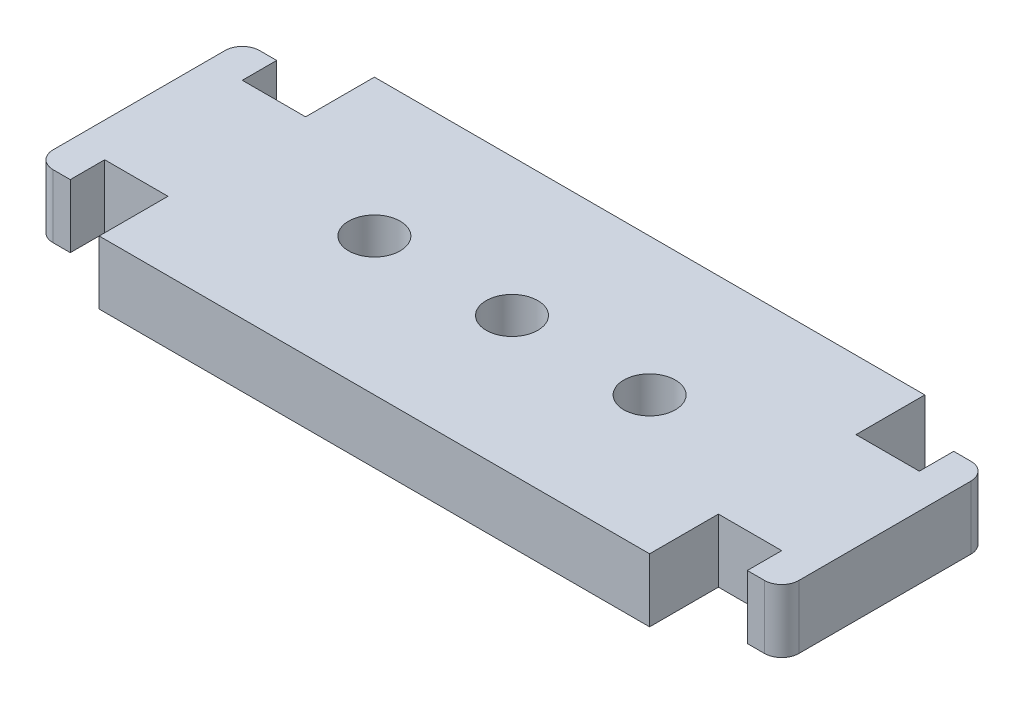
ISO-10303-21;
HEADER;
FILE_DESCRIPTION(('STEP AP214'),'2;1');
FILE_NAME('part.step','',(''),(''),'','','');
FILE_SCHEMA(('AUTOMOTIVE_DESIGN { 1 0 10303 214 1 1 1 1 }'));
ENDSEC;
DATA;
#1=APPLICATION_CONTEXT('core data for automotive mechanical design processes');
#2=APPLICATION_PROTOCOL_DEFINITION('international standard','automotive_design',2000,#1);
#3=PRODUCT_CONTEXT('',#1,'mechanical');
#4=PRODUCT('Part','Part','',(#3));
#5=PRODUCT_RELATED_PRODUCT_CATEGORY('part','',(#4));
#6=PRODUCT_DEFINITION_FORMATION('','',#4);
#7=PRODUCT_DEFINITION_CONTEXT('part definition',#1,'design');
#8=PRODUCT_DEFINITION('design','',#6,#7);
#9=PRODUCT_DEFINITION_SHAPE('','',#8);
#10=(LENGTH_UNIT() NAMED_UNIT(*) SI_UNIT(.MILLI.,.METRE.));
#11=(NAMED_UNIT(*) PLANE_ANGLE_UNIT() SI_UNIT($,.RADIAN.));
#12=(NAMED_UNIT(*) SI_UNIT($,.STERADIAN.) SOLID_ANGLE_UNIT());
#13=UNCERTAINTY_MEASURE_WITH_UNIT(LENGTH_MEASURE(1.E-05),#10,'distance_accuracy_value','');
#14=(GEOMETRIC_REPRESENTATION_CONTEXT(3) GLOBAL_UNCERTAINTY_ASSIGNED_CONTEXT((#13)) GLOBAL_UNIT_ASSIGNED_CONTEXT((#10,
#11,#12)) REPRESENTATION_CONTEXT('',''));
#15=CARTESIAN_POINT('',(0.,0.,0.));
#16=DIRECTION('',(0.,0.,1.));
#17=DIRECTION('',(1.,0.,0.));
#18=AXIS2_PLACEMENT_3D('',#15,#16,#17);
#19=CARTESIAN_POINT('',(25.4,5.842,-6.35));
#20=DIRECTION('',(-1.,0.,0.));
#21=DIRECTION('',(0.,0.,1.));
#22=AXIS2_PLACEMENT_3D('',#19,#20,#21);
#23=PLANE('',#22);
#24=DIRECTION('',(0.,0.,-1.));
#25=VECTOR('',#24,1.);
#26=CARTESIAN_POINT('',(25.4,0.,-6.35));
#27=LINE('',#26,#25);
#28=CARTESIAN_POINT('',(25.4,0.,-6.35));
#29=VERTEX_POINT('',#28);
#30=CARTESIAN_POINT('',(25.4,0.,-12.7));
#31=VERTEX_POINT('',#30);
#32=EDGE_CURVE('E219',#29,#31,#27,.T.);
#33=ORIENTED_EDGE('',*,*,#32,.T.);
#34=DIRECTION('',(0.,-1.,0.));
#35=VECTOR('',#34,1.);
#36=CARTESIAN_POINT('',(25.4,5.842,-12.7));
#37=LINE('',#36,#35);
#38=CARTESIAN_POINT('',(25.4,5.842,-12.7));
#39=VERTEX_POINT('',#38);
#40=EDGE_CURVE('E200',#39,#31,#37,.T.);
#41=ORIENTED_EDGE('',*,*,#40,.F.);
#42=DIRECTION('',(0.,0.,-1.));
#43=VECTOR('',#42,1.);
#44=CARTESIAN_POINT('',(25.4,5.842,-6.35));
#45=LINE('',#44,#43);
#46=CARTESIAN_POINT('',(25.4,5.842,-6.35));
#47=VERTEX_POINT('',#46);
#48=EDGE_CURVE('E206',#47,#39,#45,.T.);
#49=ORIENTED_EDGE('',*,*,#48,.F.);
#50=DIRECTION('',(0.,-1.,0.));
#51=VECTOR('',#50,1.);
#52=CARTESIAN_POINT('',(25.4,5.842,-6.35));
#53=LINE('',#52,#51);
#54=EDGE_CURVE('E312',#47,#29,#53,.T.);
#55=ORIENTED_EDGE('',*,*,#54,.T.);
#56=EDGE_LOOP('',(#33,#41,#49,#55));
#57=FACE_BOUND('',#56,.T.);
#58=ADVANCED_FACE('F35',(#57),#23,.F.);
#59=CARTESIAN_POINT('',(-25.4,5.842,-12.7));
#60=DIRECTION('',(0.,0.,1.));
#61=DIRECTION('',(1.,0.,0.));
#62=AXIS2_PLACEMENT_3D('',#59,#60,#61);
#63=PLANE('',#62);
#64=DIRECTION('',(-1.,0.,0.));
#65=VECTOR('',#64,1.);
#66=CARTESIAN_POINT('',(-25.4,0.,-12.7));
#67=LINE('',#66,#65);
#68=CARTESIAN_POINT('',(-25.4,0.,-12.7));
#69=VERTEX_POINT('',#68);
#70=EDGE_CURVE('E365',#31,#69,#67,.T.);
#71=ORIENTED_EDGE('',*,*,#70,.T.);
#72=DIRECTION('',(0.,-1.,0.));
#73=VECTOR('',#72,1.);
#74=CARTESIAN_POINT('',(-25.4,5.842,-12.7));
#75=LINE('',#74,#73);
#76=CARTESIAN_POINT('',(-25.4,5.842,-12.7));
#77=VERTEX_POINT('',#76);
#78=EDGE_CURVE('E203',#77,#69,#75,.T.);
#79=ORIENTED_EDGE('',*,*,#78,.F.);
#80=DIRECTION('',(-1.,0.,0.));
#81=VECTOR('',#80,1.);
#82=CARTESIAN_POINT('',(-25.4,5.842,-12.7));
#83=LINE('',#82,#81);
#84=EDGE_CURVE('E196',#39,#77,#83,.T.);
#85=ORIENTED_EDGE('',*,*,#84,.F.);
#86=ORIENTED_EDGE('',*,*,#40,.T.);
#87=EDGE_LOOP('',(#71,#79,#85,#86));
#88=FACE_BOUND('',#87,.T.);
#89=ADVANCED_FACE('F198',(#88),#63,.F.);
#90=CARTESIAN_POINT('',(-25.4,5.842,-6.35));
#91=DIRECTION('',(1.,0.,0.));
#92=DIRECTION('',(0.,0.,-1.));
#93=AXIS2_PLACEMENT_3D('',#90,#91,#92);
#94=PLANE('',#93);
#95=DIRECTION('',(0.,0.,1.));
#96=VECTOR('',#95,1.);
#97=CARTESIAN_POINT('',(-25.4,0.,-6.35));
#98=LINE('',#97,#96);
#99=CARTESIAN_POINT('',(-25.4,0.,-6.35));
#100=VERTEX_POINT('',#99);
#101=EDGE_CURVE('E360',#69,#100,#98,.T.);
#102=ORIENTED_EDGE('',*,*,#101,.T.);
#103=DIRECTION('',(0.,-1.,0.));
#104=VECTOR('',#103,1.);
#105=CARTESIAN_POINT('',(-25.4,5.842,-6.35));
#106=LINE('',#105,#104);
#107=CARTESIAN_POINT('',(-25.4,5.842,-6.35));
#108=VERTEX_POINT('',#107);
#109=EDGE_CURVE('E224',#108,#100,#106,.T.);
#110=ORIENTED_EDGE('',*,*,#109,.F.);
#111=DIRECTION('',(0.,0.,1.));
#112=VECTOR('',#111,1.);
#113=CARTESIAN_POINT('',(-25.4,5.842,-6.35));
#114=LINE('',#113,#112);
#115=EDGE_CURVE('E205',#77,#108,#114,.T.);
#116=ORIENTED_EDGE('',*,*,#115,.F.);
#117=ORIENTED_EDGE('',*,*,#78,.T.);
#118=EDGE_LOOP('',(#102,#110,#116,#117));
#119=FACE_BOUND('',#118,.T.);
#120=ADVANCED_FACE('F390',(#119),#94,.F.);
#121=CARTESIAN_POINT('',(-31.242,5.842,-6.35));
#122=DIRECTION('',(0.,0.,1.));
#123=DIRECTION('',(1.,0.,0.));
#124=AXIS2_PLACEMENT_3D('',#121,#122,#123);
#125=PLANE('',#124);
#126=DIRECTION('',(-1.,0.,0.));
#127=VECTOR('',#126,1.);
#128=CARTESIAN_POINT('',(-31.242,0.,-6.35));
#129=LINE('',#128,#127);
#130=CARTESIAN_POINT('',(-31.242,0.,-6.35));
#131=VERTEX_POINT('',#130);
#132=EDGE_CURVE('E355',#100,#131,#129,.T.);
#133=ORIENTED_EDGE('',*,*,#132,.T.);
#134=DIRECTION('',(0.,-1.,0.));
#135=VECTOR('',#134,1.);
#136=CARTESIAN_POINT('',(-31.242,5.842,-6.35));
#137=LINE('',#136,#135);
#138=CARTESIAN_POINT('',(-31.242,5.842,-6.35));
#139=VERTEX_POINT('',#138);
#140=EDGE_CURVE('E346',#139,#131,#137,.T.);
#141=ORIENTED_EDGE('',*,*,#140,.F.);
#142=DIRECTION('',(-1.,0.,0.));
#143=VECTOR('',#142,1.);
#144=CARTESIAN_POINT('',(-31.242,5.842,-6.35));
#145=LINE('',#144,#143);
#146=EDGE_CURVE('E356',#108,#139,#145,.T.);
#147=ORIENTED_EDGE('',*,*,#146,.F.);
#148=ORIENTED_EDGE('',*,*,#109,.T.);
#149=EDGE_LOOP('',(#133,#141,#147,#148));
#150=FACE_BOUND('',#149,.T.);
#151=ADVANCED_FACE('F353',(#150),#125,.F.);
#152=CARTESIAN_POINT('',(-31.242,5.842,-6.35));
#153=DIRECTION('',(-1.,0.,0.));
#154=DIRECTION('',(0.,0.,1.));
#155=AXIS2_PLACEMENT_3D('',#152,#153,#154);
#156=PLANE('',#155);
#157=DIRECTION('',(0.,0.,-1.));
#158=VECTOR('',#157,1.);
#159=CARTESIAN_POINT('',(-31.242,0.,-6.35));
#160=LINE('',#159,#158);
#161=CARTESIAN_POINT('',(-31.242,0.,-9.525));
#162=VERTEX_POINT('',#161);
#163=EDGE_CURVE('E362',#131,#162,#160,.T.);
#164=ORIENTED_EDGE('',*,*,#163,.T.);
#165=DIRECTION('',(0.,-1.,0.));
#166=VECTOR('',#165,1.);
#167=CARTESIAN_POINT('',(-31.242,5.842,-9.525));
#168=LINE('',#167,#166);
#169=CARTESIAN_POINT('',(-31.242,5.842,-9.525));
#170=VERTEX_POINT('',#169);
#171=EDGE_CURVE('E343',#170,#162,#168,.T.);
#172=ORIENTED_EDGE('',*,*,#171,.F.);
#173=DIRECTION('',(0.,0.,-1.));
#174=VECTOR('',#173,1.);
#175=CARTESIAN_POINT('',(-31.242,5.842,-6.35));
#176=LINE('',#175,#174);
#177=EDGE_CURVE('E424',#139,#170,#176,.T.);
#178=ORIENTED_EDGE('',*,*,#177,.F.);
#179=ORIENTED_EDGE('',*,*,#140,.T.);
#180=EDGE_LOOP('',(#164,#172,#178,#179));
#181=FACE_BOUND('',#180,.T.);
#182=ADVANCED_FACE('F504',(#181),#156,.F.);
#183=CARTESIAN_POINT('',(-34.417,5.842,-9.525));
#184=DIRECTION('',(0.,0.,1.));
#185=DIRECTION('',(1.,0.,0.));
#186=AXIS2_PLACEMENT_3D('',#183,#184,#185);
#187=PLANE('',#186);
#188=DIRECTION('',(-1.,0.,0.));
#189=VECTOR('',#188,1.);
#190=CARTESIAN_POINT('',(-34.417,0.,-9.525));
#191=LINE('',#190,#189);
#192=CARTESIAN_POINT('',(-32.8295,0.,-9.525));
#193=VERTEX_POINT('',#192);
#194=EDGE_CURVE('E286',#162,#193,#191,.T.);
#195=ORIENTED_EDGE('',*,*,#194,.T.);
#196=DIRECTION('',(0.,-1.,0.));
#197=VECTOR('',#196,1.);
#198=CARTESIAN_POINT('',(-32.8295,5.842,-9.525));
#199=LINE('',#198,#197);
#200=CARTESIAN_POINT('',(-32.8295,5.842,-9.525));
#201=VERTEX_POINT('',#200);
#202=EDGE_CURVE('E11',#193,#201,#199,.F.);
#203=ORIENTED_EDGE('',*,*,#202,.T.);
#204=DIRECTION('',(-1.,0.,0.));
#205=VECTOR('',#204,1.);
#206=CARTESIAN_POINT('',(-34.417,5.842,-9.525));
#207=LINE('',#206,#205);
#208=EDGE_CURVE('E267',#170,#201,#207,.T.);
#209=ORIENTED_EDGE('',*,*,#208,.F.);
#210=ORIENTED_EDGE('',*,*,#171,.T.);
#211=EDGE_LOOP('',(#195,#203,#209,#210));
#212=FACE_BOUND('',#211,.T.);
#213=ADVANCED_FACE('F371',(#212),#187,.F.);
#214=CARTESIAN_POINT('',(-34.417,5.842,9.525));
#215=DIRECTION('',(1.,0.,0.));
#216=DIRECTION('',(0.,0.,-1.));
#217=AXIS2_PLACEMENT_3D('',#214,#215,#216);
#218=PLANE('',#217);
#219=DIRECTION('',(0.,0.,1.));
#220=VECTOR('',#219,1.);
#221=CARTESIAN_POINT('',(-34.417,0.,9.525));
#222=LINE('',#221,#220);
#223=CARTESIAN_POINT('',(-34.417,0.,-7.93749999999999));
#224=VERTEX_POINT('',#223);
#225=CARTESIAN_POINT('',(-34.417,0.,7.9375));
#226=VERTEX_POINT('',#225);
#227=EDGE_CURVE('E262',#224,#226,#222,.T.);
#228=ORIENTED_EDGE('',*,*,#227,.T.);
#229=DIRECTION('',(0.,-1.,0.));
#230=VECTOR('',#229,1.);
#231=CARTESIAN_POINT('',(-34.417,5.842,7.9375));
#232=LINE('',#231,#230);
#233=CARTESIAN_POINT('',(-34.417,5.842,7.9375));
#234=VERTEX_POINT('',#233);
#235=EDGE_CURVE('E43',#226,#234,#232,.F.);
#236=ORIENTED_EDGE('',*,*,#235,.T.);
#237=DIRECTION('',(0.,0.,1.));
#238=VECTOR('',#237,1.);
#239=CARTESIAN_POINT('',(-34.417,5.842,9.525));
#240=LINE('',#239,#238);
#241=CARTESIAN_POINT('',(-34.417,5.842,-7.93749999999999));
#242=VERTEX_POINT('',#241);
#243=EDGE_CURVE('E259',#242,#234,#240,.T.);
#244=ORIENTED_EDGE('',*,*,#243,.F.);
#245=DIRECTION('',(0.,-1.,0.));
#246=VECTOR('',#245,1.);
#247=CARTESIAN_POINT('',(-34.417,5.842,-7.9375));
#248=LINE('',#247,#246);
#249=EDGE_CURVE('E252',#242,#224,#248,.T.);
#250=ORIENTED_EDGE('',*,*,#249,.T.);
#251=EDGE_LOOP('',(#228,#236,#244,#250));
#252=FACE_BOUND('',#251,.T.);
#253=ADVANCED_FACE('F258',(#252),#218,.F.);
#254=CARTESIAN_POINT('',(-34.417,5.842,9.525));
#255=DIRECTION('',(0.,0.,-1.));
#256=DIRECTION('',(-1.,0.,0.));
#257=AXIS2_PLACEMENT_3D('',#254,#255,#256);
#258=PLANE('',#257);
#259=DIRECTION('',(1.,0.,0.));
#260=VECTOR('',#259,1.);
#261=CARTESIAN_POINT('',(-34.417,5.842,9.525));
#262=LINE('',#261,#260);
#263=CARTESIAN_POINT('',(-32.8295,5.842,9.525));
#264=VERTEX_POINT('',#263);
#265=CARTESIAN_POINT('',(-31.242,5.842,9.525));
#266=VERTEX_POINT('',#265);
#267=EDGE_CURVE('E266',#264,#266,#262,.T.);
#268=ORIENTED_EDGE('',*,*,#267,.F.);
#269=DIRECTION('',(0.,-1.,0.));
#270=VECTOR('',#269,1.);
#271=CARTESIAN_POINT('',(-32.8295,5.842,9.525));
#272=LINE('',#271,#270);
#273=CARTESIAN_POINT('',(-32.8295,0.,9.525));
#274=VERTEX_POINT('',#273);
#275=EDGE_CURVE('E249',#264,#274,#272,.T.);
#276=ORIENTED_EDGE('',*,*,#275,.T.);
#277=DIRECTION('',(1.,0.,0.));
#278=VECTOR('',#277,1.);
#279=CARTESIAN_POINT('',(-34.417,0.,9.525));
#280=LINE('',#279,#278);
#281=CARTESIAN_POINT('',(-31.242,0.,9.525));
#282=VERTEX_POINT('',#281);
#283=EDGE_CURVE('E275',#274,#282,#280,.T.);
#284=ORIENTED_EDGE('',*,*,#283,.T.);
#285=DIRECTION('',(0.,-1.,0.));
#286=VECTOR('',#285,1.);
#287=CARTESIAN_POINT('',(-31.242,5.842,9.525));
#288=LINE('',#287,#286);
#289=EDGE_CURVE('E341',#266,#282,#288,.T.);
#290=ORIENTED_EDGE('',*,*,#289,.F.);
#291=EDGE_LOOP('',(#268,#276,#284,#290));
#292=FACE_BOUND('',#291,.T.);
#293=ADVANCED_FACE('F273',(#292),#258,.F.);
#294=CARTESIAN_POINT('',(-31.242,5.842,9.525));
#295=DIRECTION('',(-1.,0.,0.));
#296=DIRECTION('',(0.,0.,1.));
#297=AXIS2_PLACEMENT_3D('',#294,#295,#296);
#298=PLANE('',#297);
#299=DIRECTION('',(0.,0.,-1.));
#300=VECTOR('',#299,1.);
#301=CARTESIAN_POINT('',(-31.242,0.,9.525));
#302=LINE('',#301,#300);
#303=CARTESIAN_POINT('',(-31.242,0.,6.35));
#304=VERTEX_POINT('',#303);
#305=EDGE_CURVE('E282',#282,#304,#302,.T.);
#306=ORIENTED_EDGE('',*,*,#305,.T.);
#307=DIRECTION('',(0.,-1.,0.));
#308=VECTOR('',#307,1.);
#309=CARTESIAN_POINT('',(-31.242,5.842,6.35));
#310=LINE('',#309,#308);
#311=CARTESIAN_POINT('',(-31.242,5.842,6.35));
#312=VERTEX_POINT('',#311);
#313=EDGE_CURVE('E338',#312,#304,#310,.T.);
#314=ORIENTED_EDGE('',*,*,#313,.F.);
#315=DIRECTION('',(0.,0.,-1.));
#316=VECTOR('',#315,1.);
#317=CARTESIAN_POINT('',(-31.242,5.842,9.525));
#318=LINE('',#317,#316);
#319=EDGE_CURVE('E430',#266,#312,#318,.T.);
#320=ORIENTED_EDGE('',*,*,#319,.F.);
#321=ORIENTED_EDGE('',*,*,#289,.T.);
#322=EDGE_LOOP('',(#306,#314,#320,#321));
#323=FACE_BOUND('',#322,.T.);
#324=ADVANCED_FACE('F489',(#323),#298,.F.);
#325=CARTESIAN_POINT('',(-31.242,5.842,6.35));
#326=DIRECTION('',(0.,0.,-1.));
#327=DIRECTION('',(-1.,0.,0.));
#328=AXIS2_PLACEMENT_3D('',#325,#326,#327);
#329=PLANE('',#328);
#330=DIRECTION('',(1.,0.,0.));
#331=VECTOR('',#330,1.);
#332=CARTESIAN_POINT('',(-31.242,0.,6.35));
#333=LINE('',#332,#331);
#334=CARTESIAN_POINT('',(-25.4,0.,6.35));
#335=VERTEX_POINT('',#334);
#336=EDGE_CURVE('E284',#304,#335,#333,.T.);
#337=ORIENTED_EDGE('',*,*,#336,.T.);
#338=DIRECTION('',(0.,-1.,0.));
#339=VECTOR('',#338,1.);
#340=CARTESIAN_POINT('',(-25.4,5.842,6.35));
#341=LINE('',#340,#339);
#342=CARTESIAN_POINT('',(-25.4,5.842,6.35));
#343=VERTEX_POINT('',#342);
#344=EDGE_CURVE('E335',#343,#335,#341,.T.);
#345=ORIENTED_EDGE('',*,*,#344,.F.);
#346=DIRECTION('',(1.,0.,0.));
#347=VECTOR('',#346,1.);
#348=CARTESIAN_POINT('',(-31.242,5.842,6.35));
#349=LINE('',#348,#347);
#350=EDGE_CURVE('E432',#312,#343,#349,.T.);
#351=ORIENTED_EDGE('',*,*,#350,.F.);
#352=ORIENTED_EDGE('',*,*,#313,.T.);
#353=EDGE_LOOP('',(#337,#345,#351,#352));
#354=FACE_BOUND('',#353,.T.);
#355=ADVANCED_FACE('F485',(#354),#329,.F.);
#356=CARTESIAN_POINT('',(-25.4,5.842,12.7));
#357=DIRECTION('',(1.,0.,0.));
#358=DIRECTION('',(0.,0.,-1.));
#359=AXIS2_PLACEMENT_3D('',#356,#357,#358);
#360=PLANE('',#359);
#361=DIRECTION('',(0.,0.,1.));
#362=VECTOR('',#361,1.);
#363=CARTESIAN_POINT('',(-25.4,0.,12.7));
#364=LINE('',#363,#362);
#365=CARTESIAN_POINT('',(-25.4,0.,12.7));
#366=VERTEX_POINT('',#365);
#367=EDGE_CURVE('E291',#335,#366,#364,.T.);
#368=ORIENTED_EDGE('',*,*,#367,.T.);
#369=DIRECTION('',(0.,-1.,0.));
#370=VECTOR('',#369,1.);
#371=CARTESIAN_POINT('',(-25.4,5.842,12.7));
#372=LINE('',#371,#370);
#373=CARTESIAN_POINT('',(-25.4,5.842,12.7));
#374=VERTEX_POINT('',#373);
#375=EDGE_CURVE('E332',#374,#366,#372,.T.);
#376=ORIENTED_EDGE('',*,*,#375,.F.);
#377=DIRECTION('',(0.,0.,1.));
#378=VECTOR('',#377,1.);
#379=CARTESIAN_POINT('',(-25.4,5.842,12.7));
#380=LINE('',#379,#378);
#381=EDGE_CURVE('E434',#343,#374,#380,.T.);
#382=ORIENTED_EDGE('',*,*,#381,.F.);
#383=ORIENTED_EDGE('',*,*,#344,.T.);
#384=EDGE_LOOP('',(#368,#376,#382,#383));
#385=FACE_BOUND('',#384,.T.);
#386=ADVANCED_FACE('F480',(#385),#360,.F.);
#387=CARTESIAN_POINT('',(-25.4,5.842,12.7));
#388=DIRECTION('',(0.,0.,-1.));
#389=DIRECTION('',(-1.,0.,0.));
#390=AXIS2_PLACEMENT_3D('',#387,#388,#389);
#391=PLANE('',#390);
#392=DIRECTION('',(1.,0.,0.));
#393=VECTOR('',#392,1.);
#394=CARTESIAN_POINT('',(-25.4,0.,12.7));
#395=LINE('',#394,#393);
#396=CARTESIAN_POINT('',(25.4,0.,12.7));
#397=VERTEX_POINT('',#396);
#398=EDGE_CURVE('E293',#366,#397,#395,.T.);
#399=ORIENTED_EDGE('',*,*,#398,.T.);
#400=DIRECTION('',(0.,-1.,0.));
#401=VECTOR('',#400,1.);
#402=CARTESIAN_POINT('',(25.4,5.842,12.7));
#403=LINE('',#402,#401);
#404=CARTESIAN_POINT('',(25.4,5.842,12.7));
#405=VERTEX_POINT('',#404);
#406=EDGE_CURVE('E329',#405,#397,#403,.T.);
#407=ORIENTED_EDGE('',*,*,#406,.F.);
#408=DIRECTION('',(1.,0.,0.));
#409=VECTOR('',#408,1.);
#410=CARTESIAN_POINT('',(-25.4,5.842,12.7));
#411=LINE('',#410,#409);
#412=EDGE_CURVE('E436',#374,#405,#411,.T.);
#413=ORIENTED_EDGE('',*,*,#412,.F.);
#414=ORIENTED_EDGE('',*,*,#375,.T.);
#415=EDGE_LOOP('',(#399,#407,#413,#414));
#416=FACE_BOUND('',#415,.T.);
#417=ADVANCED_FACE('F476',(#416),#391,.F.);
#418=CARTESIAN_POINT('',(25.4,5.842,12.7));
#419=DIRECTION('',(-1.,0.,0.));
#420=DIRECTION('',(0.,0.,1.));
#421=AXIS2_PLACEMENT_3D('',#418,#419,#420);
#422=PLANE('',#421);
#423=DIRECTION('',(0.,0.,-1.));
#424=VECTOR('',#423,1.);
#425=CARTESIAN_POINT('',(25.4,0.,12.7));
#426=LINE('',#425,#424);
#427=CARTESIAN_POINT('',(25.4,0.,6.35));
#428=VERTEX_POINT('',#427);
#429=EDGE_CURVE('E295',#397,#428,#426,.T.);
#430=ORIENTED_EDGE('',*,*,#429,.T.);
#431=DIRECTION('',(0.,-1.,0.));
#432=VECTOR('',#431,1.);
#433=CARTESIAN_POINT('',(25.4,5.842,6.35));
#434=LINE('',#433,#432);
#435=CARTESIAN_POINT('',(25.4,5.842,6.35));
#436=VERTEX_POINT('',#435);
#437=EDGE_CURVE('E326',#436,#428,#434,.T.);
#438=ORIENTED_EDGE('',*,*,#437,.F.);
#439=DIRECTION('',(0.,0.,-1.));
#440=VECTOR('',#439,1.);
#441=CARTESIAN_POINT('',(25.4,5.842,12.7));
#442=LINE('',#441,#440);
#443=EDGE_CURVE('E438',#405,#436,#442,.T.);
#444=ORIENTED_EDGE('',*,*,#443,.F.);
#445=ORIENTED_EDGE('',*,*,#406,.T.);
#446=EDGE_LOOP('',(#430,#438,#444,#445));
#447=FACE_BOUND('',#446,.T.);
#448=ADVANCED_FACE('F472',(#447),#422,.F.);
#449=CARTESIAN_POINT('',(31.242,5.842,6.35));
#450=DIRECTION('',(0.,0.,-1.));
#451=DIRECTION('',(-1.,0.,0.));
#452=AXIS2_PLACEMENT_3D('',#449,#450,#451);
#453=PLANE('',#452);
#454=DIRECTION('',(1.,0.,0.));
#455=VECTOR('',#454,1.);
#456=CARTESIAN_POINT('',(31.242,0.,6.35));
#457=LINE('',#456,#455);
#458=CARTESIAN_POINT('',(31.242,0.,6.35));
#459=VERTEX_POINT('',#458);
#460=EDGE_CURVE('E297',#428,#459,#457,.T.);
#461=ORIENTED_EDGE('',*,*,#460,.T.);
#462=DIRECTION('',(0.,-1.,0.));
#463=VECTOR('',#462,1.);
#464=CARTESIAN_POINT('',(31.242,5.842,6.35));
#465=LINE('',#464,#463);
#466=CARTESIAN_POINT('',(31.242,5.842,6.35));
#467=VERTEX_POINT('',#466);
#468=EDGE_CURVE('E323',#467,#459,#465,.T.);
#469=ORIENTED_EDGE('',*,*,#468,.F.);
#470=DIRECTION('',(1.,0.,0.));
#471=VECTOR('',#470,1.);
#472=CARTESIAN_POINT('',(31.242,5.842,6.35));
#473=LINE('',#472,#471);
#474=EDGE_CURVE('E440',#436,#467,#473,.T.);
#475=ORIENTED_EDGE('',*,*,#474,.F.);
#476=ORIENTED_EDGE('',*,*,#437,.T.);
#477=EDGE_LOOP('',(#461,#469,#475,#476));
#478=FACE_BOUND('',#477,.T.);
#479=ADVANCED_FACE('F467',(#478),#453,.F.);
#480=CARTESIAN_POINT('',(31.242,5.842,9.525));
#481=DIRECTION('',(1.,0.,0.));
#482=DIRECTION('',(0.,0.,-1.));
#483=AXIS2_PLACEMENT_3D('',#480,#481,#482);
#484=PLANE('',#483);
#485=DIRECTION('',(0.,0.,1.));
#486=VECTOR('',#485,1.);
#487=CARTESIAN_POINT('',(31.242,0.,9.525));
#488=LINE('',#487,#486);
#489=CARTESIAN_POINT('',(31.242,0.,9.525));
#490=VERTEX_POINT('',#489);
#491=EDGE_CURVE('E299',#459,#490,#488,.T.);
#492=ORIENTED_EDGE('',*,*,#491,.T.);
#493=DIRECTION('',(0.,-1.,0.));
#494=VECTOR('',#493,1.);
#495=CARTESIAN_POINT('',(31.242,5.842,9.525));
#496=LINE('',#495,#494);
#497=CARTESIAN_POINT('',(31.242,5.842,9.525));
#498=VERTEX_POINT('',#497);
#499=EDGE_CURVE('E320',#498,#490,#496,.T.);
#500=ORIENTED_EDGE('',*,*,#499,.F.);
#501=DIRECTION('',(0.,0.,1.));
#502=VECTOR('',#501,1.);
#503=CARTESIAN_POINT('',(31.242,5.842,9.525));
#504=LINE('',#503,#502);
#505=EDGE_CURVE('E442',#467,#498,#504,.T.);
#506=ORIENTED_EDGE('',*,*,#505,.F.);
#507=ORIENTED_EDGE('',*,*,#468,.T.);
#508=EDGE_LOOP('',(#492,#500,#506,#507));
#509=FACE_BOUND('',#508,.T.);
#510=ADVANCED_FACE('F461',(#509),#484,.F.);
#511=CARTESIAN_POINT('',(34.417,5.842,9.525));
#512=DIRECTION('',(0.,0.,-1.));
#513=DIRECTION('',(-1.,0.,0.));
#514=AXIS2_PLACEMENT_3D('',#511,#512,#513);
#515=PLANE('',#514);
#516=DIRECTION('',(1.,0.,0.));
#517=VECTOR('',#516,1.);
#518=CARTESIAN_POINT('',(34.417,0.,9.525));
#519=LINE('',#518,#517);
#520=CARTESIAN_POINT('',(32.8295,0.,9.525));
#521=VERTEX_POINT('',#520);
#522=EDGE_CURVE('E301',#490,#521,#519,.T.);
#523=ORIENTED_EDGE('',*,*,#522,.T.);
#524=DIRECTION('',(0.,-1.,0.));
#525=VECTOR('',#524,1.);
#526=CARTESIAN_POINT('',(32.8295,5.842,9.525));
#527=LINE('',#526,#525);
#528=CARTESIAN_POINT('',(32.8295,5.842,9.525));
#529=VERTEX_POINT('',#528);
#530=EDGE_CURVE('E238',#521,#529,#527,.F.);
#531=ORIENTED_EDGE('',*,*,#530,.T.);
#532=DIRECTION('',(1.,0.,0.));
#533=VECTOR('',#532,1.);
#534=CARTESIAN_POINT('',(34.417,5.842,9.525));
#535=LINE('',#534,#533);
#536=EDGE_CURVE('E444',#498,#529,#535,.T.);
#537=ORIENTED_EDGE('',*,*,#536,.F.);
#538=ORIENTED_EDGE('',*,*,#499,.T.);
#539=EDGE_LOOP('',(#523,#531,#537,#538));
#540=FACE_BOUND('',#539,.T.);
#541=ADVANCED_FACE('F456',(#540),#515,.F.);
#542=CARTESIAN_POINT('',(34.417,5.842,9.525));
#543=DIRECTION('',(-1.,0.,0.));
#544=DIRECTION('',(0.,0.,1.));
#545=AXIS2_PLACEMENT_3D('',#542,#543,#544);
#546=PLANE('',#545);
#547=DIRECTION('',(0.,0.,-1.));
#548=VECTOR('',#547,1.);
#549=CARTESIAN_POINT('',(34.417,5.842,9.525));
#550=LINE('',#549,#548);
#551=CARTESIAN_POINT('',(34.417,5.842,7.9375));
#552=VERTEX_POINT('',#551);
#553=CARTESIAN_POINT('',(34.417,5.842,-7.93749999999999));
#554=VERTEX_POINT('',#553);
#555=EDGE_CURVE('E446',#552,#554,#550,.T.);
#556=ORIENTED_EDGE('',*,*,#555,.F.);
#557=DIRECTION('',(0.,-1.,0.));
#558=VECTOR('',#557,1.);
#559=CARTESIAN_POINT('',(34.417,5.842,7.9375));
#560=LINE('',#559,#558);
#561=CARTESIAN_POINT('',(34.417,0.,7.9375));
#562=VERTEX_POINT('',#561);
#563=EDGE_CURVE('E222',#552,#562,#560,.T.);
#564=ORIENTED_EDGE('',*,*,#563,.T.);
#565=DIRECTION('',(0.,0.,-1.));
#566=VECTOR('',#565,1.);
#567=CARTESIAN_POINT('',(34.417,0.,9.525));
#568=LINE('',#567,#566);
#569=CARTESIAN_POINT('',(34.417,0.,-7.93749999999999));
#570=VERTEX_POINT('',#569);
#571=EDGE_CURVE('E304',#562,#570,#568,.T.);
#572=ORIENTED_EDGE('',*,*,#571,.T.);
#573=DIRECTION('',(0.,-1.,0.));
#574=VECTOR('',#573,1.);
#575=CARTESIAN_POINT('',(34.417,5.842,-7.9375));
#576=LINE('',#575,#574);
#577=EDGE_CURVE('E220',#570,#554,#576,.F.);
#578=ORIENTED_EDGE('',*,*,#577,.T.);
#579=EDGE_LOOP('',(#556,#564,#572,#578));
#580=FACE_BOUND('',#579,.T.);
#581=ADVANCED_FACE('F451',(#580),#546,.F.);
#582=CARTESIAN_POINT('',(34.417,5.842,-9.525));
#583=DIRECTION('',(0.,0.,1.));
#584=DIRECTION('',(1.,0.,0.));
#585=AXIS2_PLACEMENT_3D('',#582,#583,#584);
#586=PLANE('',#585);
#587=DIRECTION('',(-1.,0.,0.));
#588=VECTOR('',#587,1.);
#589=CARTESIAN_POINT('',(34.417,5.842,-9.525));
#590=LINE('',#589,#588);
#591=CARTESIAN_POINT('',(32.8295,5.842,-9.525));
#592=VERTEX_POINT('',#591);
#593=CARTESIAN_POINT('',(31.242,5.842,-9.525));
#594=VERTEX_POINT('',#593);
#595=EDGE_CURVE('E408',#592,#594,#590,.T.);
#596=ORIENTED_EDGE('',*,*,#595,.F.);
#597=DIRECTION('',(0.,-1.,0.));
#598=VECTOR('',#597,1.);
#599=CARTESIAN_POINT('',(32.8295,5.842,-9.525));
#600=LINE('',#599,#598);
#601=CARTESIAN_POINT('',(32.8295,0.,-9.525));
#602=VERTEX_POINT('',#601);
#603=EDGE_CURVE('E246',#592,#602,#600,.T.);
#604=ORIENTED_EDGE('',*,*,#603,.T.);
#605=DIRECTION('',(-1.,0.,0.));
#606=VECTOR('',#605,1.);
#607=CARTESIAN_POINT('',(34.417,0.,-9.525));
#608=LINE('',#607,#606);
#609=CARTESIAN_POINT('',(31.242,0.,-9.525));
#610=VERTEX_POINT('',#609);
#611=EDGE_CURVE('E307',#602,#610,#608,.T.);
#612=ORIENTED_EDGE('',*,*,#611,.T.);
#613=DIRECTION('',(0.,-1.,0.));
#614=VECTOR('',#613,1.);
#615=CARTESIAN_POINT('',(31.242,5.842,-9.525));
#616=LINE('',#615,#614);
#617=EDGE_CURVE('E317',#594,#610,#616,.T.);
#618=ORIENTED_EDGE('',*,*,#617,.F.);
#619=EDGE_LOOP('',(#596,#604,#612,#618));
#620=FACE_BOUND('',#619,.T.);
#621=ADVANCED_FACE('F406',(#620),#586,.F.);
#622=CARTESIAN_POINT('',(31.242,5.842,-6.35));
#623=DIRECTION('',(1.,0.,0.));
#624=DIRECTION('',(0.,0.,-1.));
#625=AXIS2_PLACEMENT_3D('',#622,#623,#624);
#626=PLANE('',#625);
#627=DIRECTION('',(0.,0.,1.));
#628=VECTOR('',#627,1.);
#629=CARTESIAN_POINT('',(31.242,0.,-6.35));
#630=LINE('',#629,#628);
#631=CARTESIAN_POINT('',(31.242,0.,-6.35));
#632=VERTEX_POINT('',#631);
#633=EDGE_CURVE('E309',#610,#632,#630,.T.);
#634=ORIENTED_EDGE('',*,*,#633,.T.);
#635=DIRECTION('',(0.,-1.,0.));
#636=VECTOR('',#635,1.);
#637=CARTESIAN_POINT('',(31.242,5.842,-6.35));
#638=LINE('',#637,#636);
#639=CARTESIAN_POINT('',(31.242,5.842,-6.35));
#640=VERTEX_POINT('',#639);
#641=EDGE_CURVE('E314',#640,#632,#638,.T.);
#642=ORIENTED_EDGE('',*,*,#641,.F.);
#643=DIRECTION('',(0.,0.,1.));
#644=VECTOR('',#643,1.);
#645=CARTESIAN_POINT('',(31.242,5.842,-6.35));
#646=LINE('',#645,#644);
#647=EDGE_CURVE('E417',#594,#640,#646,.T.);
#648=ORIENTED_EDGE('',*,*,#647,.F.);
#649=ORIENTED_EDGE('',*,*,#617,.T.);
#650=EDGE_LOOP('',(#634,#642,#648,#649));
#651=FACE_BOUND('',#650,.T.);
#652=ADVANCED_FACE('F413',(#651),#626,.F.);
#653=CARTESIAN_POINT('',(31.242,5.842,-6.35));
#654=DIRECTION('',(0.,0.,1.));
#655=DIRECTION('',(1.,0.,0.));
#656=AXIS2_PLACEMENT_3D('',#653,#654,#655);
#657=PLANE('',#656);
#658=DIRECTION('',(-1.,0.,0.));
#659=VECTOR('',#658,1.);
#660=CARTESIAN_POINT('',(31.242,0.,-6.35));
#661=LINE('',#660,#659);
#662=EDGE_CURVE('E216',#632,#29,#661,.T.);
#663=ORIENTED_EDGE('',*,*,#662,.T.);
#664=ORIENTED_EDGE('',*,*,#54,.F.);
#665=DIRECTION('',(-1.,0.,0.));
#666=VECTOR('',#665,1.);
#667=CARTESIAN_POINT('',(31.242,5.842,-6.35));
#668=LINE('',#667,#666);
#669=EDGE_CURVE('E212',#640,#47,#668,.T.);
#670=ORIENTED_EDGE('',*,*,#669,.F.);
#671=ORIENTED_EDGE('',*,*,#641,.T.);
#672=EDGE_LOOP('',(#663,#664,#670,#671));
#673=FACE_BOUND('',#672,.T.);
#674=ADVANCED_FACE('F416',(#673),#657,.F.);
#675=CARTESIAN_POINT('',(0.,5.842,0.));
#676=DIRECTION('',(0.,-1.,0.));
#677=DIRECTION('',(0.,0.,-1.));
#678=AXIS2_PLACEMENT_3D('',#675,#676,#677);
#679=PLANE('',#678);
#680=CARTESIAN_POINT('',(-12.7,5.842,0.));
#681=DIRECTION('',(0.,1.,0.));
#682=DIRECTION('',(0.,0.,-1.));
#683=AXIS2_PLACEMENT_3D('',#680,#681,#682);
#684=CIRCLE('',#683,2.38125);
#685=CARTESIAN_POINT('',(-12.7,5.842,-2.38125));
#686=VERTEX_POINT('',#685);
#687=EDGE_CURVE('E700',#686,#686,#684,.T.);
#688=ORIENTED_EDGE('',*,*,#687,.F.);
#689=EDGE_LOOP('',(#688));
#690=FACE_BOUND('',#689,.T.);
#691=CARTESIAN_POINT('',(12.7,5.842,0.));
#692=DIRECTION('',(0.,1.,0.));
#693=DIRECTION('',(0.,0.,1.));
#694=AXIS2_PLACEMENT_3D('',#691,#692,#693);
#695=CIRCLE('',#694,2.38125);
#696=CARTESIAN_POINT('',(12.7,5.842,2.38125));
#697=VERTEX_POINT('',#696);
#698=EDGE_CURVE('E702',#697,#697,#695,.T.);
#699=ORIENTED_EDGE('',*,*,#698,.F.);
#700=EDGE_LOOP('',(#699));
#701=FACE_BOUND('',#700,.T.);
#702=CARTESIAN_POINT('',(0.,5.842,0.));
#703=DIRECTION('',(0.,1.,0.));
#704=DIRECTION('',(0.,0.,1.));
#705=AXIS2_PLACEMENT_3D('',#702,#703,#704);
#706=CIRCLE('',#705,2.38125);
#707=CARTESIAN_POINT('',(0.,5.842,2.38125));
#708=VERTEX_POINT('',#707);
#709=EDGE_CURVE('E708',#708,#708,#706,.T.);
#710=ORIENTED_EDGE('',*,*,#709,.F.);
#711=EDGE_LOOP('',(#710));
#712=FACE_BOUND('',#711,.T.);
#713=ORIENTED_EDGE('',*,*,#536,.T.);
#714=CARTESIAN_POINT('',(32.8295,5.842,7.9375));
#715=DIRECTION('',(0.,-1.,0.));
#716=DIRECTION('',(0.,0.,-1.));
#717=AXIS2_PLACEMENT_3D('',#714,#715,#716);
#718=CIRCLE('',#717,1.5875);
#719=EDGE_CURVE('E244',#529,#552,#718,.F.);
#720=ORIENTED_EDGE('',*,*,#719,.T.);
#721=ORIENTED_EDGE('',*,*,#555,.T.);
#722=CARTESIAN_POINT('',(32.8295,5.842,-7.9375));
#723=DIRECTION('',(0.,-1.,0.));
#724=DIRECTION('',(0.,0.,-1.));
#725=AXIS2_PLACEMENT_3D('',#722,#723,#724);
#726=CIRCLE('',#725,1.5875);
#727=EDGE_CURVE('E50',#554,#592,#726,.F.);
#728=ORIENTED_EDGE('',*,*,#727,.T.);
#729=ORIENTED_EDGE('',*,*,#595,.T.);
#730=ORIENTED_EDGE('',*,*,#647,.T.);
#731=ORIENTED_EDGE('',*,*,#669,.T.);
#732=ORIENTED_EDGE('',*,*,#48,.T.);
#733=ORIENTED_EDGE('',*,*,#84,.T.);
#734=ORIENTED_EDGE('',*,*,#115,.T.);
#735=ORIENTED_EDGE('',*,*,#146,.T.);
#736=ORIENTED_EDGE('',*,*,#177,.T.);
#737=ORIENTED_EDGE('',*,*,#208,.T.);
#738=CARTESIAN_POINT('',(-32.8295,5.842,-7.9375));
#739=DIRECTION('',(0.,-1.,0.));
#740=DIRECTION('',(0.,0.,-1.));
#741=AXIS2_PLACEMENT_3D('',#738,#739,#740);
#742=CIRCLE('',#741,1.5875);
#743=EDGE_CURVE('E240',#201,#242,#742,.F.);
#744=ORIENTED_EDGE('',*,*,#743,.T.);
#745=ORIENTED_EDGE('',*,*,#243,.T.);
#746=CARTESIAN_POINT('',(-32.8295,5.842,7.9375));
#747=DIRECTION('',(0.,-1.,0.));
#748=DIRECTION('',(0.,0.,-1.));
#749=AXIS2_PLACEMENT_3D('',#746,#747,#748);
#750=CIRCLE('',#749,1.5875);
#751=EDGE_CURVE('E57',#234,#264,#750,.F.);
#752=ORIENTED_EDGE('',*,*,#751,.T.);
#753=ORIENTED_EDGE('',*,*,#267,.T.);
#754=ORIENTED_EDGE('',*,*,#319,.T.);
#755=ORIENTED_EDGE('',*,*,#350,.T.);
#756=ORIENTED_EDGE('',*,*,#381,.T.);
#757=ORIENTED_EDGE('',*,*,#412,.T.);
#758=ORIENTED_EDGE('',*,*,#443,.T.);
#759=ORIENTED_EDGE('',*,*,#474,.T.);
#760=ORIENTED_EDGE('',*,*,#505,.T.);
#761=EDGE_LOOP('',(#713,#720,#721,#728,#729,#730,#731,#732,#733,#734,#735,#736,#737,#744,#745,
#752,#753,#754,#755,#756,#757,#758,#759,#760));
#762=FACE_BOUND('',#761,.T.);
#763=ADVANCED_FACE('F210',(#690,#701,#712,#762),#679,.F.);
#764=CARTESIAN_POINT('',(0.,0.,0.));
#765=DIRECTION('',(0.,-1.,0.));
#766=DIRECTION('',(0.,0.,-1.));
#767=AXIS2_PLACEMENT_3D('',#764,#765,#766);
#768=PLANE('',#767);
#769=CARTESIAN_POINT('',(-12.7,0.,0.));
#770=DIRECTION('',(0.,1.,0.));
#771=DIRECTION('',(0.,0.,-1.));
#772=AXIS2_PLACEMENT_3D('',#769,#770,#771);
#773=CIRCLE('',#772,2.38125);
#774=CARTESIAN_POINT('',(-12.7,0.,-2.38125));
#775=VERTEX_POINT('',#774);
#776=EDGE_CURVE('E697',#775,#775,#773,.T.);
#777=ORIENTED_EDGE('',*,*,#776,.T.);
#778=EDGE_LOOP('',(#777));
#779=FACE_BOUND('',#778,.T.);
#780=CARTESIAN_POINT('',(12.7,0.,0.));
#781=DIRECTION('',(0.,1.,0.));
#782=DIRECTION('',(0.,0.,1.));
#783=AXIS2_PLACEMENT_3D('',#780,#781,#782);
#784=CIRCLE('',#783,2.38125);
#785=CARTESIAN_POINT('',(12.7,0.,2.38125));
#786=VERTEX_POINT('',#785);
#787=EDGE_CURVE('E705',#786,#786,#784,.T.);
#788=ORIENTED_EDGE('',*,*,#787,.T.);
#789=EDGE_LOOP('',(#788));
#790=FACE_BOUND('',#789,.T.);
#791=CARTESIAN_POINT('',(0.,0.,0.));
#792=DIRECTION('',(0.,1.,0.));
#793=DIRECTION('',(0.,0.,1.));
#794=AXIS2_PLACEMENT_3D('',#791,#792,#793);
#795=CIRCLE('',#794,2.38125);
#796=CARTESIAN_POINT('',(0.,0.,2.38125));
#797=VERTEX_POINT('',#796);
#798=EDGE_CURVE('E422',#797,#797,#795,.T.);
#799=ORIENTED_EDGE('',*,*,#798,.T.);
#800=EDGE_LOOP('',(#799));
#801=FACE_BOUND('',#800,.T.);
#802=ORIENTED_EDGE('',*,*,#571,.F.);
#803=CARTESIAN_POINT('',(32.8295,0.,7.9375));
#804=DIRECTION('',(0.,-1.,0.));
#805=DIRECTION('',(0.,0.,-1.));
#806=AXIS2_PLACEMENT_3D('',#803,#804,#805);
#807=CIRCLE('',#806,1.5875);
#808=EDGE_CURVE('E236',#562,#521,#807,.T.);
#809=ORIENTED_EDGE('',*,*,#808,.T.);
#810=ORIENTED_EDGE('',*,*,#522,.F.);
#811=ORIENTED_EDGE('',*,*,#491,.F.);
#812=ORIENTED_EDGE('',*,*,#460,.F.);
#813=ORIENTED_EDGE('',*,*,#429,.F.);
#814=ORIENTED_EDGE('',*,*,#398,.F.);
#815=ORIENTED_EDGE('',*,*,#367,.F.);
#816=ORIENTED_EDGE('',*,*,#336,.F.);
#817=ORIENTED_EDGE('',*,*,#305,.F.);
#818=ORIENTED_EDGE('',*,*,#283,.F.);
#819=CARTESIAN_POINT('',(-32.8295,0.,7.9375));
#820=DIRECTION('',(0.,-1.,0.));
#821=DIRECTION('',(0.,0.,-1.));
#822=AXIS2_PLACEMENT_3D('',#819,#820,#821);
#823=CIRCLE('',#822,1.5875);
#824=EDGE_CURVE('E232',#274,#226,#823,.T.);
#825=ORIENTED_EDGE('',*,*,#824,.T.);
#826=ORIENTED_EDGE('',*,*,#227,.F.);
#827=CARTESIAN_POINT('',(-32.8295,0.,-7.9375));
#828=DIRECTION('',(0.,-1.,0.));
#829=DIRECTION('',(0.,0.,-1.));
#830=AXIS2_PLACEMENT_3D('',#827,#828,#829);
#831=CIRCLE('',#830,1.5875);
#832=EDGE_CURVE('E230',#224,#193,#831,.T.);
#833=ORIENTED_EDGE('',*,*,#832,.T.);
#834=ORIENTED_EDGE('',*,*,#194,.F.);
#835=ORIENTED_EDGE('',*,*,#163,.F.);
#836=ORIENTED_EDGE('',*,*,#132,.F.);
#837=ORIENTED_EDGE('',*,*,#101,.F.);
#838=ORIENTED_EDGE('',*,*,#70,.F.);
#839=ORIENTED_EDGE('',*,*,#32,.F.);
#840=ORIENTED_EDGE('',*,*,#662,.F.);
#841=ORIENTED_EDGE('',*,*,#633,.F.);
#842=ORIENTED_EDGE('',*,*,#611,.F.);
#843=CARTESIAN_POINT('',(32.8295,0.,-7.9375));
#844=DIRECTION('',(0.,-1.,0.));
#845=DIRECTION('',(0.,0.,-1.));
#846=AXIS2_PLACEMENT_3D('',#843,#844,#845);
#847=CIRCLE('',#846,1.5875);
#848=EDGE_CURVE('E234',#602,#570,#847,.T.);
#849=ORIENTED_EDGE('',*,*,#848,.T.);
#850=EDGE_LOOP('',(#802,#809,#810,#811,#812,#813,#814,#815,#816,#817,#818,#825,#826,#833,#834,
#835,#836,#837,#838,#839,#840,#841,#842,#849));
#851=FACE_BOUND('',#850,.T.);
#852=ADVANCED_FACE('F280',(#779,#790,#801,#851),#768,.T.);
#853=CARTESIAN_POINT('',(32.8295,5.842,7.9375));
#854=DIRECTION('',(0.,-1.,0.));
#855=DIRECTION('',(0.,0.,-1.));
#856=AXIS2_PLACEMENT_3D('',#853,#854,#855);
#857=CYLINDRICAL_SURFACE('',#856,1.5875);
#858=ORIENTED_EDGE('',*,*,#719,.F.);
#859=ORIENTED_EDGE('',*,*,#530,.F.);
#860=ORIENTED_EDGE('',*,*,#808,.F.);
#861=ORIENTED_EDGE('',*,*,#563,.F.);
#862=EDGE_LOOP('',(#858,#859,#860,#861));
#863=FACE_BOUND('',#862,.T.);
#864=ADVANCED_FACE('F394',(#863),#857,.T.);
#865=CARTESIAN_POINT('',(32.8295,5.842,-7.9375));
#866=DIRECTION('',(0.,-1.,0.));
#867=DIRECTION('',(0.,0.,-1.));
#868=AXIS2_PLACEMENT_3D('',#865,#866,#867);
#869=CYLINDRICAL_SURFACE('',#868,1.5875);
#870=ORIENTED_EDGE('',*,*,#727,.F.);
#871=ORIENTED_EDGE('',*,*,#577,.F.);
#872=ORIENTED_EDGE('',*,*,#848,.F.);
#873=ORIENTED_EDGE('',*,*,#603,.F.);
#874=EDGE_LOOP('',(#870,#871,#872,#873));
#875=FACE_BOUND('',#874,.T.);
#876=ADVANCED_FACE('F384',(#875),#869,.T.);
#877=CARTESIAN_POINT('',(-32.8295,5.842,7.9375));
#878=DIRECTION('',(0.,-1.,0.));
#879=DIRECTION('',(0.,0.,-1.));
#880=AXIS2_PLACEMENT_3D('',#877,#878,#879);
#881=CYLINDRICAL_SURFACE('',#880,1.5875);
#882=ORIENTED_EDGE('',*,*,#751,.F.);
#883=ORIENTED_EDGE('',*,*,#235,.F.);
#884=ORIENTED_EDGE('',*,*,#824,.F.);
#885=ORIENTED_EDGE('',*,*,#275,.F.);
#886=EDGE_LOOP('',(#882,#883,#884,#885));
#887=FACE_BOUND('',#886,.T.);
#888=ADVANCED_FACE('F270',(#887),#881,.T.);
#889=CARTESIAN_POINT('',(-32.8295,5.842,-7.9375));
#890=DIRECTION('',(0.,-1.,0.));
#891=DIRECTION('',(0.,0.,-1.));
#892=AXIS2_PLACEMENT_3D('',#889,#890,#891);
#893=CYLINDRICAL_SURFACE('',#892,1.5875);
#894=ORIENTED_EDGE('',*,*,#743,.F.);
#895=ORIENTED_EDGE('',*,*,#202,.F.);
#896=ORIENTED_EDGE('',*,*,#832,.F.);
#897=ORIENTED_EDGE('',*,*,#249,.F.);
#898=EDGE_LOOP('',(#894,#895,#896,#897));
#899=FACE_BOUND('',#898,.T.);
#900=ADVANCED_FACE('F37',(#899),#893,.T.);
#901=CARTESIAN_POINT('',(0.,0.,0.));
#902=DIRECTION('',(0.,1.,0.));
#903=DIRECTION('',(0.,0.,1.));
#904=AXIS2_PLACEMENT_3D('',#901,#902,#903);
#905=CYLINDRICAL_SURFACE('',#904,2.38125);
#906=ORIENTED_EDGE('',*,*,#798,.F.);
#907=EDGE_LOOP('',(#906));
#908=FACE_BOUND('',#907,.T.);
#909=ORIENTED_EDGE('',*,*,#709,.T.);
#910=EDGE_LOOP('',(#909));
#911=FACE_BOUND('',#910,.T.);
#912=ADVANCED_FACE('F376',(#908,#911),#905,.F.);
#913=CARTESIAN_POINT('',(12.7,0.,0.));
#914=DIRECTION('',(0.,1.,0.));
#915=DIRECTION('',(0.,0.,1.));
#916=AXIS2_PLACEMENT_3D('',#913,#914,#915);
#917=CYLINDRICAL_SURFACE('',#916,2.38125);
#918=ORIENTED_EDGE('',*,*,#787,.F.);
#919=EDGE_LOOP('',(#918));
#920=FACE_BOUND('',#919,.T.);
#921=ORIENTED_EDGE('',*,*,#698,.T.);
#922=EDGE_LOOP('',(#921));
#923=FACE_BOUND('',#922,.T.);
#924=ADVANCED_FACE('F381',(#920,#923),#917,.F.);
#925=CARTESIAN_POINT('',(-12.7,0.,0.));
#926=DIRECTION('',(0.,1.,0.));
#927=DIRECTION('',(0.,0.,1.));
#928=AXIS2_PLACEMENT_3D('',#925,#926,#927);
#929=CYLINDRICAL_SURFACE('',#928,2.38125);
#930=ORIENTED_EDGE('',*,*,#776,.F.);
#931=EDGE_LOOP('',(#930));
#932=FACE_BOUND('',#931,.T.);
#933=ORIENTED_EDGE('',*,*,#687,.T.);
#934=EDGE_LOOP('',(#933));
#935=FACE_BOUND('',#934,.T.);
#936=ADVANCED_FACE('F618',(#932,#935),#929,.F.);
#937=CLOSED_SHELL('',(#58,#89,#120,#151,#182,#213,#253,#293,#324,#355,#386,#417,#448,#479,#510,
#541,#581,#621,#652,#674,#763,#852,#864,#876,#888,#900,#912,#924,#936));
#938=MANIFOLD_SOLID_BREP('B2',#937);
#939=ADVANCED_BREP_SHAPE_REPRESENTATION('',(#18,#938),#14);
#940=SHAPE_DEFINITION_REPRESENTATION(#9,#939);
ENDSEC;
END-ISO-10303-21;
